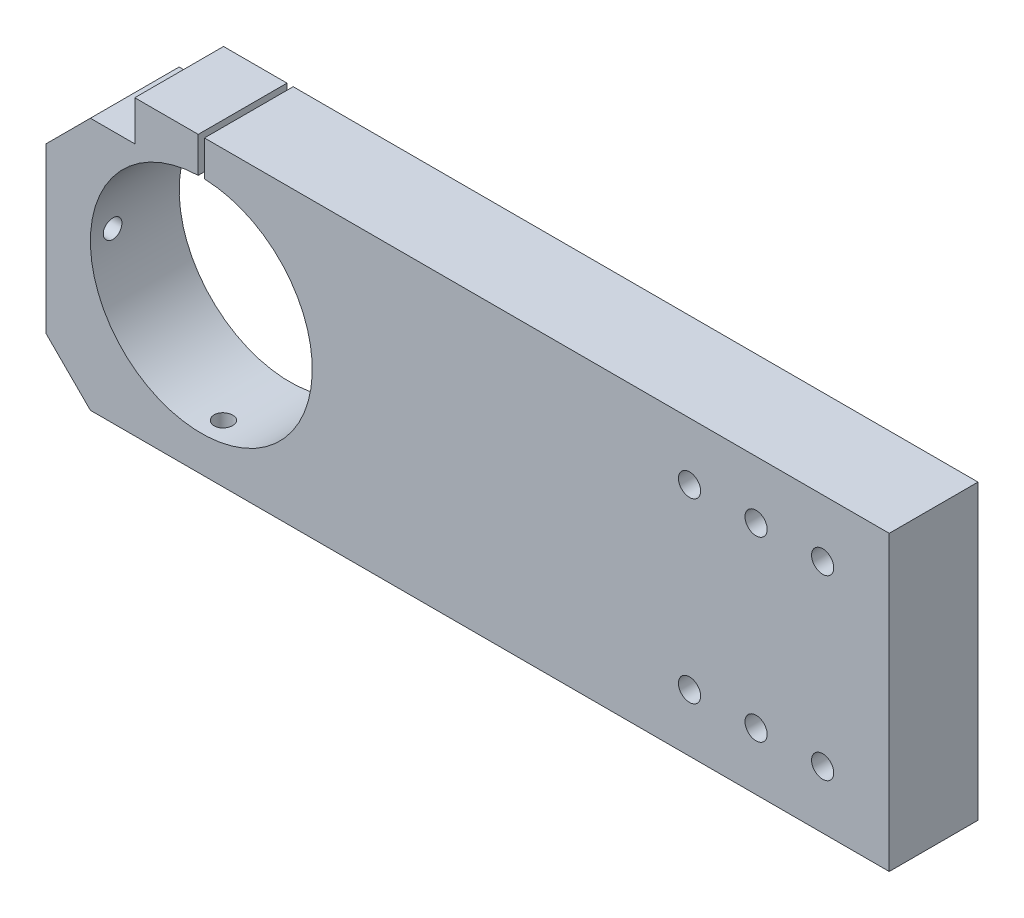
ISO-10303-21;
HEADER;
FILE_DESCRIPTION(('STEP AP214'),'2;1');
FILE_NAME('part.step','',(''),(''),'','','');
FILE_SCHEMA(('AUTOMOTIVE_DESIGN { 1 0 10303 214 1 1 1 1 }'));
ENDSEC;
DATA;
#1=APPLICATION_CONTEXT('core data for automotive mechanical design processes');
#2=APPLICATION_PROTOCOL_DEFINITION('international standard','automotive_design',2000,#1);
#3=PRODUCT_CONTEXT('',#1,'mechanical');
#4=PRODUCT('Part','Part','',(#3));
#5=PRODUCT_RELATED_PRODUCT_CATEGORY('part','',(#4));
#6=PRODUCT_DEFINITION_FORMATION('','',#4);
#7=PRODUCT_DEFINITION_CONTEXT('part definition',#1,'design');
#8=PRODUCT_DEFINITION('design','',#6,#7);
#9=PRODUCT_DEFINITION_SHAPE('','',#8);
#10=(LENGTH_UNIT() NAMED_UNIT(*) SI_UNIT(.MILLI.,.METRE.));
#11=(NAMED_UNIT(*) PLANE_ANGLE_UNIT() SI_UNIT($,.RADIAN.));
#12=(NAMED_UNIT(*) SI_UNIT($,.STERADIAN.) SOLID_ANGLE_UNIT());
#13=UNCERTAINTY_MEASURE_WITH_UNIT(LENGTH_MEASURE(1.E-05),#10,'distance_accuracy_value','');
#14=(GEOMETRIC_REPRESENTATION_CONTEXT(3) GLOBAL_UNCERTAINTY_ASSIGNED_CONTEXT((#13)) GLOBAL_UNIT_ASSIGNED_CONTEXT((#10,
#11,#12)) REPRESENTATION_CONTEXT('',''));
#15=CARTESIAN_POINT('',(0.,0.,0.));
#16=DIRECTION('',(0.,0.,1.));
#17=DIRECTION('',(1.,0.,0.));
#18=AXIS2_PLACEMENT_3D('',#15,#16,#17);
#19=CARTESIAN_POINT('',(0.,66.,20.));
#20=DIRECTION('',(0.,-1.,0.));
#21=DIRECTION('',(0.,0.,-1.));
#22=AXIS2_PLACEMENT_3D('',#19,#20,#21);
#23=PLANE('',#22);
#24=DIRECTION('',(-1.,0.,0.));
#25=VECTOR('',#24,1.);
#26=CARTESIAN_POINT('',(0.,66.,20.));
#27=LINE('',#26,#25);
#28=CARTESIAN_POINT('',(34.3,66.,20.));
#29=VERTEX_POINT('',#28);
#30=CARTESIAN_POINT('',(20.,66.,20.));
#31=VERTEX_POINT('',#30);
#32=EDGE_CURVE('E225',#29,#31,#27,.T.);
#33=ORIENTED_EDGE('',*,*,#32,.F.);
#34=DIRECTION('',(0.,0.,-1.));
#35=VECTOR('',#34,1.);
#36=CARTESIAN_POINT('',(34.3,66.,20.));
#37=LINE('',#36,#35);
#38=CARTESIAN_POINT('',(34.3,66.,0.));
#39=VERTEX_POINT('',#38);
#40=EDGE_CURVE('E187',#29,#39,#37,.T.);
#41=ORIENTED_EDGE('',*,*,#40,.T.);
#42=DIRECTION('',(-1.,0.,0.));
#43=VECTOR('',#42,1.);
#44=CARTESIAN_POINT('',(0.,66.,0.));
#45=LINE('',#44,#43);
#46=CARTESIAN_POINT('',(20.,66.,0.));
#47=VERTEX_POINT('',#46);
#48=EDGE_CURVE('E235',#39,#47,#45,.T.);
#49=ORIENTED_EDGE('',*,*,#48,.T.);
#50=DIRECTION('',(0.,0.,-1.));
#51=VECTOR('',#50,1.);
#52=CARTESIAN_POINT('',(20.,66.,20.));
#53=LINE('',#52,#51);
#54=EDGE_CURVE('E202',#31,#47,#53,.T.);
#55=ORIENTED_EDGE('',*,*,#54,.F.);
#56=EDGE_LOOP('',(#33,#41,#49,#55));
#57=FACE_BOUND('',#56,.T.);
#58=ADVANCED_FACE('F49',(#57),#23,.F.);
#59=CARTESIAN_POINT('',(0.,0.,20.));
#60=DIRECTION('',(1.,0.,0.));
#61=DIRECTION('',(0.,0.,-1.));
#62=AXIS2_PLACEMENT_3D('',#59,#60,#61);
#63=PLANE('',#62);
#64=CARTESIAN_POINT('',(0.,33.,15.));
#65=DIRECTION('',(-1.,0.,0.));
#66=DIRECTION('',(0.,0.,1.));
#67=AXIS2_PLACEMENT_3D('',#64,#65,#66);
#68=CIRCLE('',#67,2.09999999999999);
#69=CARTESIAN_POINT('',(0.,33.,17.1));
#70=VERTEX_POINT('',#69);
#71=EDGE_CURVE('E266',#70,#70,#68,.T.);
#72=ORIENTED_EDGE('',*,*,#71,.F.);
#73=EDGE_LOOP('',(#72));
#74=FACE_BOUND('',#73,.T.);
#75=DIRECTION('',(0.,-1.,0.));
#76=VECTOR('',#75,1.);
#77=CARTESIAN_POINT('',(0.,0.,0.));
#78=LINE('',#77,#76);
#79=CARTESIAN_POINT('',(0.,47.,0.));
#80=VERTEX_POINT('',#79);
#81=CARTESIAN_POINT('',(0.,10.,0.));
#82=VERTEX_POINT('',#81);
#83=EDGE_CURVE('E215',#80,#82,#78,.T.);
#84=ORIENTED_EDGE('',*,*,#83,.T.);
#85=DIRECTION('',(0.,0.,1.));
#86=VECTOR('',#85,1.);
#87=CARTESIAN_POINT('',(0.,10.,20.));
#88=LINE('',#87,#86);
#89=CARTESIAN_POINT('',(0.,10.,20.));
#90=VERTEX_POINT('',#89);
#91=EDGE_CURVE('E64',#82,#90,#88,.T.);
#92=ORIENTED_EDGE('',*,*,#91,.T.);
#93=DIRECTION('',(0.,-1.,0.));
#94=VECTOR('',#93,1.);
#95=CARTESIAN_POINT('',(0.,0.,20.));
#96=LINE('',#95,#94);
#97=CARTESIAN_POINT('',(0.,47.,20.));
#98=VERTEX_POINT('',#97);
#99=EDGE_CURVE('E218',#98,#90,#96,.T.);
#100=ORIENTED_EDGE('',*,*,#99,.F.);
#101=DIRECTION('',(0.,0.,-1.));
#102=VECTOR('',#101,1.);
#103=CARTESIAN_POINT('',(0.,47.,20.));
#104=LINE('',#103,#102);
#105=EDGE_CURVE('E249',#98,#80,#104,.T.);
#106=ORIENTED_EDGE('',*,*,#105,.T.);
#107=EDGE_LOOP('',(#84,#92,#100,#106));
#108=FACE_BOUND('',#107,.T.);
#109=ADVANCED_FACE('F355',(#74,#108),#63,.F.);
#110=CARTESIAN_POINT('',(0.,0.,20.));
#111=DIRECTION('',(0.,1.,0.));
#112=DIRECTION('',(0.,0.,1.));
#113=AXIS2_PLACEMENT_3D('',#110,#111,#112);
#114=PLANE('',#113);
#115=CARTESIAN_POINT('',(35.,0.,15.));
#116=DIRECTION('',(0.,-1.,0.));
#117=DIRECTION('',(0.,0.,-1.));
#118=AXIS2_PLACEMENT_3D('',#115,#116,#117);
#119=CIRCLE('',#118,2.09999999999999);
#120=CARTESIAN_POINT('',(35.,0.,12.9));
#121=VERTEX_POINT('',#120);
#122=EDGE_CURVE('E267',#121,#121,#119,.T.);
#123=ORIENTED_EDGE('',*,*,#122,.F.);
#124=EDGE_LOOP('',(#123));
#125=FACE_BOUND('',#124,.T.);
#126=DIRECTION('',(1.,0.,0.));
#127=VECTOR('',#126,1.);
#128=CARTESIAN_POINT('',(0.,0.,20.));
#129=LINE('',#128,#127);
#130=CARTESIAN_POINT('',(10.,0.,20.));
#131=VERTEX_POINT('',#130);
#132=CARTESIAN_POINT('',(190.,0.,20.));
#133=VERTEX_POINT('',#132);
#134=EDGE_CURVE('E220',#131,#133,#129,.T.);
#135=ORIENTED_EDGE('',*,*,#134,.F.);
#136=DIRECTION('',(0.,0.,-1.));
#137=VECTOR('',#136,1.);
#138=CARTESIAN_POINT('',(10.,0.,20.));
#139=LINE('',#138,#137);
#140=CARTESIAN_POINT('',(10.,0.,0.));
#141=VERTEX_POINT('',#140);
#142=EDGE_CURVE('E258',#131,#141,#139,.T.);
#143=ORIENTED_EDGE('',*,*,#142,.T.);
#144=DIRECTION('',(1.,0.,0.));
#145=VECTOR('',#144,1.);
#146=CARTESIAN_POINT('',(0.,0.,0.));
#147=LINE('',#146,#145);
#148=CARTESIAN_POINT('',(190.,0.,0.));
#149=VERTEX_POINT('',#148);
#150=EDGE_CURVE('E231',#141,#149,#147,.T.);
#151=ORIENTED_EDGE('',*,*,#150,.T.);
#152=DIRECTION('',(0.,0.,-1.));
#153=VECTOR('',#152,1.);
#154=CARTESIAN_POINT('',(190.,0.,20.));
#155=LINE('',#154,#153);
#156=EDGE_CURVE('E240',#133,#149,#155,.T.);
#157=ORIENTED_EDGE('',*,*,#156,.F.);
#158=EDGE_LOOP('',(#135,#143,#151,#157));
#159=FACE_BOUND('',#158,.T.);
#160=ADVANCED_FACE('F362',(#125,#159),#114,.F.);
#161=CARTESIAN_POINT('',(190.,0.,20.));
#162=DIRECTION('',(-1.,0.,0.));
#163=DIRECTION('',(0.,0.,1.));
#164=AXIS2_PLACEMENT_3D('',#161,#162,#163);
#165=PLANE('',#164);
#166=DIRECTION('',(0.,1.,0.));
#167=VECTOR('',#166,1.);
#168=CARTESIAN_POINT('',(190.,0.,0.));
#169=LINE('',#168,#167);
#170=CARTESIAN_POINT('',(190.,66.,0.));
#171=VERTEX_POINT('',#170);
#172=EDGE_CURVE('E233',#149,#171,#169,.T.);
#173=ORIENTED_EDGE('',*,*,#172,.T.);
#174=DIRECTION('',(0.,0.,-1.));
#175=VECTOR('',#174,1.);
#176=CARTESIAN_POINT('',(190.,66.,20.));
#177=LINE('',#176,#175);
#178=CARTESIAN_POINT('',(190.,66.,20.));
#179=VERTEX_POINT('',#178);
#180=EDGE_CURVE('E229',#179,#171,#177,.T.);
#181=ORIENTED_EDGE('',*,*,#180,.F.);
#182=DIRECTION('',(0.,1.,0.));
#183=VECTOR('',#182,1.);
#184=CARTESIAN_POINT('',(190.,0.,20.));
#185=LINE('',#184,#183);
#186=EDGE_CURVE('E223',#133,#179,#185,.T.);
#187=ORIENTED_EDGE('',*,*,#186,.F.);
#188=ORIENTED_EDGE('',*,*,#156,.T.);
#189=EDGE_LOOP('',(#173,#181,#187,#188));
#190=FACE_BOUND('',#189,.T.);
#191=ADVANCED_FACE('F368',(#190),#165,.F.);
#192=CARTESIAN_POINT('',(35.7,66.,0.));
#193=VERTEX_POINT('',#192);
#194=EDGE_CURVE('E221',#171,#193,#45,.T.);
#195=ORIENTED_EDGE('',*,*,#194,.T.);
#196=DIRECTION('',(0.,0.,-1.));
#197=VECTOR('',#196,1.);
#198=CARTESIAN_POINT('',(35.7,66.,20.));
#199=LINE('',#198,#197);
#200=CARTESIAN_POINT('',(35.7,66.,20.));
#201=VERTEX_POINT('',#200);
#202=EDGE_CURVE('E190',#201,#193,#199,.T.);
#203=ORIENTED_EDGE('',*,*,#202,.F.);
#204=EDGE_CURVE('E226',#179,#201,#27,.T.);
#205=ORIENTED_EDGE('',*,*,#204,.F.);
#206=ORIENTED_EDGE('',*,*,#180,.T.);
#207=EDGE_LOOP('',(#195,#203,#205,#206));
#208=FACE_BOUND('',#207,.T.);
#209=ADVANCED_FACE('F358',(#208),#23,.F.);
#210=CARTESIAN_POINT('',(0.,66.,20.));
#211=DIRECTION('',(0.,0.,-1.));
#212=DIRECTION('',(-1.,0.,0.));
#213=AXIS2_PLACEMENT_3D('',#210,#211,#212);
#214=PLANE('',#213);
#215=CARTESIAN_POINT('',(160.,13.,20.));
#216=DIRECTION('',(0.,0.,-1.));
#217=DIRECTION('',(-1.,0.,0.));
#218=AXIS2_PLACEMENT_3D('',#215,#216,#217);
#219=CIRCLE('',#218,2.5);
#220=CARTESIAN_POINT('',(157.5,13.,20.));
#221=VERTEX_POINT('',#220);
#222=EDGE_CURVE('E318',#221,#221,#219,.T.);
#223=ORIENTED_EDGE('',*,*,#222,.T.);
#224=EDGE_LOOP('',(#223));
#225=FACE_BOUND('',#224,.T.);
#226=CARTESIAN_POINT('',(160.,53.,20.));
#227=DIRECTION('',(0.,0.,-1.));
#228=DIRECTION('',(-1.,0.,0.));
#229=AXIS2_PLACEMENT_3D('',#226,#227,#228);
#230=CIRCLE('',#229,2.5);
#231=CARTESIAN_POINT('',(157.5,53.,20.));
#232=VERTEX_POINT('',#231);
#233=EDGE_CURVE('E312',#232,#232,#230,.T.);
#234=ORIENTED_EDGE('',*,*,#233,.T.);
#235=EDGE_LOOP('',(#234));
#236=FACE_BOUND('',#235,.T.);
#237=CARTESIAN_POINT('',(175.,53.,20.));
#238=DIRECTION('',(0.,0.,-1.));
#239=DIRECTION('',(-1.,0.,0.));
#240=AXIS2_PLACEMENT_3D('',#237,#238,#239);
#241=CIRCLE('',#240,2.5);
#242=CARTESIAN_POINT('',(172.5,53.,20.));
#243=VERTEX_POINT('',#242);
#244=EDGE_CURVE('E303',#243,#243,#241,.T.);
#245=ORIENTED_EDGE('',*,*,#244,.T.);
#246=EDGE_LOOP('',(#245));
#247=FACE_BOUND('',#246,.T.);
#248=CARTESIAN_POINT('',(175.,13.,20.));
#249=DIRECTION('',(0.,0.,-1.));
#250=DIRECTION('',(-1.,0.,0.));
#251=AXIS2_PLACEMENT_3D('',#248,#249,#250);
#252=CIRCLE('',#251,2.5);
#253=CARTESIAN_POINT('',(172.5,13.,20.));
#254=VERTEX_POINT('',#253);
#255=EDGE_CURVE('E297',#254,#254,#252,.T.);
#256=ORIENTED_EDGE('',*,*,#255,.T.);
#257=EDGE_LOOP('',(#256));
#258=FACE_BOUND('',#257,.T.);
#259=ORIENTED_EDGE('',*,*,#99,.T.);
#260=DIRECTION('',(-0.707106781186547,0.707106781186549,0.));
#261=VECTOR('',#260,1.);
#262=CARTESIAN_POINT('',(10.,0.,20.));
#263=LINE('',#262,#261);
#264=EDGE_CURVE('E396',#90,#131,#263,.F.);
#265=ORIENTED_EDGE('',*,*,#264,.T.);
#266=ORIENTED_EDGE('',*,*,#134,.T.);
#267=ORIENTED_EDGE('',*,*,#186,.T.);
#268=ORIENTED_EDGE('',*,*,#204,.T.);
#269=DIRECTION('',(0.,-1.,0.));
#270=VECTOR('',#269,1.);
#271=CARTESIAN_POINT('',(35.7,66.,20.));
#272=LINE('',#271,#270);
#273=CARTESIAN_POINT('',(35.7,57.9901980784467,20.));
#274=VERTEX_POINT('',#273);
#275=EDGE_CURVE('E183',#201,#274,#272,.T.);
#276=ORIENTED_EDGE('',*,*,#275,.T.);
#277=CARTESIAN_POINT('',(35.,33.,20.));
#278=DIRECTION('',(0.,0.,-1.));
#279=DIRECTION('',(-1.,0.,0.));
#280=AXIS2_PLACEMENT_3D('',#277,#278,#279);
#281=CIRCLE('',#280,25.);
#282=CARTESIAN_POINT('',(34.3,57.9901980784467,20.));
#283=VERTEX_POINT('',#282);
#284=EDGE_CURVE('E212',#274,#283,#281,.T.);
#285=ORIENTED_EDGE('',*,*,#284,.T.);
#286=DIRECTION('',(0.,1.,0.));
#287=VECTOR('',#286,1.);
#288=CARTESIAN_POINT('',(34.3,66.,20.));
#289=LINE('',#288,#287);
#290=EDGE_CURVE('E180',#283,#29,#289,.T.);
#291=ORIENTED_EDGE('',*,*,#290,.T.);
#292=ORIENTED_EDGE('',*,*,#32,.T.);
#293=DIRECTION('',(0.,-1.,0.));
#294=VECTOR('',#293,1.);
#295=CARTESIAN_POINT('',(20.,66.,20.));
#296=LINE('',#295,#294);
#297=CARTESIAN_POINT('',(20.,57.,20.));
#298=VERTEX_POINT('',#297);
#299=EDGE_CURVE('E195',#31,#298,#296,.T.);
#300=ORIENTED_EDGE('',*,*,#299,.T.);
#301=DIRECTION('',(-1.,0.,0.));
#302=VECTOR('',#301,1.);
#303=CARTESIAN_POINT('',(0.,57.,20.));
#304=LINE('',#303,#302);
#305=CARTESIAN_POINT('',(10.,57.,20.));
#306=VERTEX_POINT('',#305);
#307=EDGE_CURVE('E198',#298,#306,#304,.T.);
#308=ORIENTED_EDGE('',*,*,#307,.T.);
#309=DIRECTION('',(0.707106781186549,0.707106781186547,0.));
#310=VECTOR('',#309,1.);
#311=CARTESIAN_POINT('',(0.,47.,20.));
#312=LINE('',#311,#310);
#313=EDGE_CURVE('E256',#306,#98,#312,.F.);
#314=ORIENTED_EDGE('',*,*,#313,.T.);
#315=EDGE_LOOP('',(#259,#265,#266,#267,#268,#276,#285,#291,#292,#300,#308,#314));
#316=FACE_BOUND('',#315,.T.);
#317=CARTESIAN_POINT('',(145.,53.,20.));
#318=DIRECTION('',(0.,0.,-1.));
#319=DIRECTION('',(-1.,0.,0.));
#320=AXIS2_PLACEMENT_3D('',#317,#318,#319);
#321=CIRCLE('',#320,2.5);
#322=CARTESIAN_POINT('',(142.5,53.,20.));
#323=VERTEX_POINT('',#322);
#324=EDGE_CURVE('E400',#323,#323,#321,.T.);
#325=ORIENTED_EDGE('',*,*,#324,.T.);
#326=EDGE_LOOP('',(#325));
#327=FACE_BOUND('',#326,.T.);
#328=CARTESIAN_POINT('',(145.,13.,20.));
#329=DIRECTION('',(0.,0.,-1.));
#330=DIRECTION('',(-1.,0.,0.));
#331=AXIS2_PLACEMENT_3D('',#328,#329,#330);
#332=CIRCLE('',#331,2.5);
#333=CARTESIAN_POINT('',(142.5,13.,20.));
#334=VERTEX_POINT('',#333);
#335=EDGE_CURVE('E57',#334,#334,#332,.T.);
#336=ORIENTED_EDGE('',*,*,#335,.T.);
#337=EDGE_LOOP('',(#336));
#338=FACE_BOUND('',#337,.T.);
#339=ADVANCED_FACE('F322',(#225,#236,#247,#258,#316,#327,#338),#214,.F.);
#340=CARTESIAN_POINT('',(0.,66.,0.));
#341=DIRECTION('',(0.,0.,-1.));
#342=DIRECTION('',(-1.,0.,0.));
#343=AXIS2_PLACEMENT_3D('',#340,#341,#342);
#344=PLANE('',#343);
#345=CARTESIAN_POINT('',(160.,13.,0.));
#346=DIRECTION('',(0.,0.,-1.));
#347=DIRECTION('',(-1.,0.,0.));
#348=AXIS2_PLACEMENT_3D('',#345,#346,#347);
#349=CIRCLE('',#348,2.5);
#350=CARTESIAN_POINT('',(157.5,13.,0.));
#351=VERTEX_POINT('',#350);
#352=EDGE_CURVE('E315',#351,#351,#349,.T.);
#353=ORIENTED_EDGE('',*,*,#352,.F.);
#354=EDGE_LOOP('',(#353));
#355=FACE_BOUND('',#354,.T.);
#356=CARTESIAN_POINT('',(160.,53.,0.));
#357=DIRECTION('',(0.,0.,-1.));
#358=DIRECTION('',(-1.,0.,0.));
#359=AXIS2_PLACEMENT_3D('',#356,#357,#358);
#360=CIRCLE('',#359,2.5);
#361=CARTESIAN_POINT('',(157.5,53.,0.));
#362=VERTEX_POINT('',#361);
#363=EDGE_CURVE('E309',#362,#362,#360,.T.);
#364=ORIENTED_EDGE('',*,*,#363,.F.);
#365=EDGE_LOOP('',(#364));
#366=FACE_BOUND('',#365,.T.);
#367=CARTESIAN_POINT('',(175.,53.,0.));
#368=DIRECTION('',(0.,0.,-1.));
#369=DIRECTION('',(-1.,0.,0.));
#370=AXIS2_PLACEMENT_3D('',#367,#368,#369);
#371=CIRCLE('',#370,2.5);
#372=CARTESIAN_POINT('',(172.5,53.,0.));
#373=VERTEX_POINT('',#372);
#374=EDGE_CURVE('E306',#373,#373,#371,.T.);
#375=ORIENTED_EDGE('',*,*,#374,.F.);
#376=EDGE_LOOP('',(#375));
#377=FACE_BOUND('',#376,.T.);
#378=CARTESIAN_POINT('',(175.,13.,0.));
#379=DIRECTION('',(0.,0.,-1.));
#380=DIRECTION('',(-1.,0.,0.));
#381=AXIS2_PLACEMENT_3D('',#378,#379,#380);
#382=CIRCLE('',#381,2.5);
#383=CARTESIAN_POINT('',(172.5,13.,0.));
#384=VERTEX_POINT('',#383);
#385=EDGE_CURVE('E300',#384,#384,#382,.T.);
#386=ORIENTED_EDGE('',*,*,#385,.F.);
#387=EDGE_LOOP('',(#386));
#388=FACE_BOUND('',#387,.T.);
#389=ORIENTED_EDGE('',*,*,#150,.F.);
#390=DIRECTION('',(0.707106781186547,-0.707106781186549,0.));
#391=VECTOR('',#390,1.);
#392=CARTESIAN_POINT('',(-28.,38.0000000000001,0.));
#393=LINE('',#392,#391);
#394=EDGE_CURVE('E72',#141,#82,#393,.F.);
#395=ORIENTED_EDGE('',*,*,#394,.T.);
#396=ORIENTED_EDGE('',*,*,#83,.F.);
#397=DIRECTION('',(-0.707106781186549,-0.707106781186547,0.));
#398=VECTOR('',#397,1.);
#399=CARTESIAN_POINT('',(9.50000000000001,56.5,0.));
#400=LINE('',#399,#398);
#401=CARTESIAN_POINT('',(10.,57.,0.));
#402=VERTEX_POINT('',#401);
#403=EDGE_CURVE('E252',#80,#402,#400,.F.);
#404=ORIENTED_EDGE('',*,*,#403,.T.);
#405=DIRECTION('',(-1.,0.,0.));
#406=VECTOR('',#405,1.);
#407=CARTESIAN_POINT('',(0.,57.,0.));
#408=LINE('',#407,#406);
#409=CARTESIAN_POINT('',(20.,57.,0.));
#410=VERTEX_POINT('',#409);
#411=EDGE_CURVE('E199',#410,#402,#408,.T.);
#412=ORIENTED_EDGE('',*,*,#411,.F.);
#413=DIRECTION('',(0.,-1.,0.));
#414=VECTOR('',#413,1.);
#415=CARTESIAN_POINT('',(20.,66.,0.));
#416=LINE('',#415,#414);
#417=EDGE_CURVE('E192',#47,#410,#416,.T.);
#418=ORIENTED_EDGE('',*,*,#417,.F.);
#419=ORIENTED_EDGE('',*,*,#48,.F.);
#420=DIRECTION('',(0.,1.,0.));
#421=VECTOR('',#420,1.);
#422=CARTESIAN_POINT('',(34.3,66.,0.));
#423=LINE('',#422,#421);
#424=CARTESIAN_POINT('',(34.3,57.9901980784467,0.));
#425=VERTEX_POINT('',#424);
#426=EDGE_CURVE('E179',#425,#39,#423,.T.);
#427=ORIENTED_EDGE('',*,*,#426,.F.);
#428=CARTESIAN_POINT('',(35.,33.,0.));
#429=DIRECTION('',(0.,0.,-1.));
#430=DIRECTION('',(-1.,0.,0.));
#431=AXIS2_PLACEMENT_3D('',#428,#429,#430);
#432=CIRCLE('',#431,25.);
#433=CARTESIAN_POINT('',(35.7,57.9901980784467,0.));
#434=VERTEX_POINT('',#433);
#435=EDGE_CURVE('E209',#434,#425,#432,.T.);
#436=ORIENTED_EDGE('',*,*,#435,.F.);
#437=DIRECTION('',(0.,-1.,0.));
#438=VECTOR('',#437,1.);
#439=CARTESIAN_POINT('',(35.7,66.,0.));
#440=LINE('',#439,#438);
#441=EDGE_CURVE('E184',#193,#434,#440,.T.);
#442=ORIENTED_EDGE('',*,*,#441,.F.);
#443=ORIENTED_EDGE('',*,*,#194,.F.);
#444=ORIENTED_EDGE('',*,*,#172,.F.);
#445=EDGE_LOOP('',(#389,#395,#396,#404,#412,#418,#419,#427,#436,#442,#443,#444));
#446=FACE_BOUND('',#445,.T.);
#447=CARTESIAN_POINT('',(145.,53.,0.));
#448=DIRECTION('',(0.,0.,-1.));
#449=DIRECTION('',(-1.,0.,0.));
#450=AXIS2_PLACEMENT_3D('',#447,#448,#449);
#451=CIRCLE('',#450,2.5);
#452=CARTESIAN_POINT('',(142.5,53.,0.));
#453=VERTEX_POINT('',#452);
#454=EDGE_CURVE('E346',#453,#453,#451,.T.);
#455=ORIENTED_EDGE('',*,*,#454,.F.);
#456=EDGE_LOOP('',(#455));
#457=FACE_BOUND('',#456,.T.);
#458=CARTESIAN_POINT('',(145.,13.,0.));
#459=DIRECTION('',(0.,0.,-1.));
#460=DIRECTION('',(-1.,0.,0.));
#461=AXIS2_PLACEMENT_3D('',#458,#459,#460);
#462=CIRCLE('',#461,2.5);
#463=CARTESIAN_POINT('',(142.5,13.,0.));
#464=VERTEX_POINT('',#463);
#465=EDGE_CURVE('E13',#464,#464,#462,.T.);
#466=ORIENTED_EDGE('',*,*,#465,.F.);
#467=EDGE_LOOP('',(#466));
#468=FACE_BOUND('',#467,.T.);
#469=ADVANCED_FACE('F332',(#355,#366,#377,#388,#446,#457,#468),#344,.T.);
#470=CARTESIAN_POINT('',(35.,33.,20.));
#471=DIRECTION('',(0.,0.,-1.));
#472=DIRECTION('',(-1.,0.,0.));
#473=AXIS2_PLACEMENT_3D('',#470,#471,#472);
#474=CYLINDRICAL_SURFACE('',#473,25.);
#475=CARTESIAN_POINT('',(35.,7.99999999999999,12.9));
#476=CARTESIAN_POINT('',(35.1177352783013,8.00000115488606,12.9000051408791));
#477=CARTESIAN_POINT('',(35.2355506214571,8.00084056094198,12.9099344453353));
#478=CARTESIAN_POINT('',(35.4679213554313,8.00410841132111,12.9493980688019));
#479=CARTESIAN_POINT('',(35.5824729034685,8.00653865405473,12.9789545765367));
#480=CARTESIAN_POINT('',(35.8049169840241,8.01271355940635,13.0568116625786));
#481=CARTESIAN_POINT('',(35.9128132534793,8.01645747634984,13.1051016089535));
#482=CARTESIAN_POINT('',(36.1189430333512,8.02483991454837,13.2190357180899));
#483=CARTESIAN_POINT('',(36.2171785992232,8.02947824487943,13.2846761782686));
#484=CARTESIAN_POINT('',(36.4014783013193,8.03914248165488,13.4316313716932));
#485=CARTESIAN_POINT('',(36.487513997325,8.04416925284801,13.5129817187292));
#486=CARTESIAN_POINT('',(36.6447276901954,8.05403657071035,13.6889721753222));
#487=CARTESIAN_POINT('',(36.7159050331262,8.05887710917558,13.7836128694969));
#488=CARTESIAN_POINT('',(36.8414779874834,8.06783318482658,13.983669935315));
#489=CARTESIAN_POINT('',(36.8958485756664,8.07194763708617,14.0891020664206));
#490=CARTESIAN_POINT('',(36.9861047941802,8.078975761126,14.3076393660494));
#491=CARTESIAN_POINT('',(37.0219907557417,8.08188945442275,14.4207443970391));
#492=CARTESIAN_POINT('',(37.0741764924337,8.08617887677492,14.651131713523));
#493=CARTESIAN_POINT('',(37.0905226330064,8.08755824603781,14.7684034277508));
#494=CARTESIAN_POINT('',(37.1033079599496,8.08863434241399,15.0040334873598));
#495=CARTESIAN_POINT('',(37.0997475253731,8.08833110156684,15.1223918120075));
#496=CARTESIAN_POINT('',(37.0728590862967,8.08607954829749,15.35651752407));
#497=CARTESIAN_POINT('',(37.0495814807632,8.08413543015907,15.4722907455866));
#498=CARTESIAN_POINT('',(36.9839977695796,8.07882775532496,15.6982810938201));
#499=CARTESIAN_POINT('',(36.9416914754658,8.07546418457077,15.8084981654959));
#500=CARTESIAN_POINT('',(36.8391949080723,8.06769177044973,16.0204081135657));
#501=CARTESIAN_POINT('',(36.7789820322351,8.06328160745305,16.122090007194));
#502=CARTESIAN_POINT('',(36.6423978168818,8.05391414158301,16.3139231142982));
#503=CARTESIAN_POINT('',(36.5660261447876,8.04895682744925,16.404074090385));
#504=CARTESIAN_POINT('',(36.3990096176639,8.03903496920524,16.5705793446656));
#505=CARTESIAN_POINT('',(36.3083211936169,8.03407045041746,16.6468899284008));
#506=CARTESIAN_POINT('',(36.1153974495413,8.02470821945034,16.7832103527582));
#507=CARTESIAN_POINT('',(36.0131621216337,8.02031050765777,16.8432201822577));
#508=CARTESIAN_POINT('',(35.8000181872971,8.01257653627317,16.9452329542325));
#509=CARTESIAN_POINT('',(35.6891086453093,8.00924039137384,16.9872339511868));
#510=CARTESIAN_POINT('',(35.4617776797128,8.00400675680558,17.0520061588965));
#511=CARTESIAN_POINT('',(35.3453563723892,8.00210923679941,17.0747777751557));
#512=CARTESIAN_POINT('',(35.1106853747472,7.99997054575322,17.1003900122088));
#513=CARTESIAN_POINT('',(34.992442314973,7.99972435932172,17.1032909842246));
#514=CARTESIAN_POINT('',(34.7571515337775,8.00090267701532,17.0892376989712));
#515=CARTESIAN_POINT('',(34.6401038010353,8.00232716530257,17.0722836299261));
#516=CARTESIAN_POINT('',(34.4106983899788,8.00668341136638,17.0190515490914));
#517=CARTESIAN_POINT('',(34.2983341731986,8.00961298617196,16.9828015213358));
#518=CARTESIAN_POINT('',(34.0812828403295,8.01665032163601,16.8920351174363));
#519=CARTESIAN_POINT('',(33.9765958475365,8.02075810121119,16.8375184480091));
#520=CARTESIAN_POINT('',(33.7775960617659,8.02970390146248,16.7116146994927));
#521=CARTESIAN_POINT('',(33.6833086353112,8.03454364226497,16.6401876509329));
#522=CARTESIAN_POINT('',(33.5080405421837,8.04440387918544,16.482548418167));
#523=CARTESIAN_POINT('',(33.4270601104714,8.04942437849316,16.3963359729511));
#524=CARTESIAN_POINT('',(33.2804976385377,8.05909514497734,16.2113112635592));
#525=CARTESIAN_POINT('',(33.2149549894621,8.06374444546135,16.1124677391878));
#526=CARTESIAN_POINT('',(33.101398716546,8.07213268050712,15.9051422282657));
#527=CARTESIAN_POINT('',(33.0533849152823,8.07587162428319,15.7966603392862));
#528=CARTESIAN_POINT('',(32.9763163299322,8.08201036521238,15.5732768202399));
#529=CARTESIAN_POINT('',(32.9472374570474,8.08441186328315,15.4583835495978));
#530=CARTESIAN_POINT('',(32.9087857522753,8.08760948633615,15.2253242522826));
#531=CARTESIAN_POINT('',(32.8994125351914,8.0884056426988,15.1071582896283));
#532=CARTESIAN_POINT('',(32.9006426961369,8.08830197367111,14.8712993802416));
#533=CARTESIAN_POINT('',(32.9111841822916,8.08740740280066,14.7536061034461));
#534=CARTESIAN_POINT('',(32.9518154338912,8.08403424112624,14.5216678625957));
#535=CARTESIAN_POINT('',(32.9819052289033,8.08155564792642,14.4074229037566));
#536=CARTESIAN_POINT('',(33.0607632303909,8.0752951028711,14.1856204242271));
#537=CARTESIAN_POINT('',(33.1095302953292,8.07151323067221,14.0780624952986));
#538=CARTESIAN_POINT('',(33.2243516001317,8.06307212083486,13.8726503009238));
#539=CARTESIAN_POINT('',(33.2904055750837,8.05841289664163,13.7747958868083));
#540=CARTESIAN_POINT('',(33.4381582270317,8.04872483669745,13.5912516975067));
#541=CARTESIAN_POINT('',(33.5199027415577,8.04369494529817,13.5055988772096));
#542=CARTESIAN_POINT('',(33.6966325555482,8.03384193197634,13.3491945719311));
#543=CARTESIAN_POINT('',(33.7916210528491,8.02901886036049,13.2784466962254));
#544=CARTESIAN_POINT('',(33.9923283144631,8.020114084077,13.1537641194458));
#545=CARTESIAN_POINT('',(34.0980669661894,8.01603379390454,13.099861359914));
#546=CARTESIAN_POINT('',(34.3170563528454,8.00909085834524,13.0106443337383));
#547=CARTESIAN_POINT('',(34.4302982893934,8.00622681500228,12.9753087148391));
#548=CARTESIAN_POINT('',(34.6201727322574,8.00277374277055,12.9332213799956));
#549=CARTESIAN_POINT('',(34.6955843910162,8.00173832868148,12.9207799380569));
#550=CARTESIAN_POINT('',(34.8473194759794,8.00035108372071,12.9041675921898));
#551=CARTESIAN_POINT('',(34.9236428997166,7.99999925099976,12.8999966658879));
#552=CARTESIAN_POINT('',(35.,7.99999999999999,12.9));
#553=B_SPLINE_CURVE_WITH_KNOTS('',3,(#475,#476,#477,#478,#479,#480,#481,#482,#483,#484,#485,
#486,#487,#488,#489,#490,#491,#492,#493,#494,#495,#496,#497,#498,#499,#500,#501,#502,#503,#504,
#505,#506,#507,#508,#509,#510,#511,#512,#513,#514,#515,#516,#517,#518,#519,#520,#521,#522,#523,
#524,#525,#526,#527,#528,#529,#530,#531,#532,#533,#534,#535,#536,#537,#538,#539,#540,#541,#542,
#543,#544,#545,#546,#547,#548,#549,#550,#551,#552),.UNSPECIFIED.,.T.,.F.,(4,2,2,2,2,2,2,2,2,2,2,
2,2,2,2,2,2,2,2,2,2,2,2,2,2,2,2,2,2,2,2,2,2,2,2,2,2,2,4),(0.,0.352927046496939,
0.706253760891373,1.05938024173724,1.4124314264912,1.76629256661712,2.12016927731718,
2.47457035810149,2.8289650880625,3.1825172056825,3.53606259113143,3.88870699850852,
4.24135489861776,4.59444983114923,4.94755203174141,5.30175028419993,5.65594877834427,
6.01018552744687,6.36441480631846,6.7175677392908,7.07071732443182,7.42335614292492,
7.77600062354197,8.12948708788754,8.48297979304837,8.83736493102254,9.19174648188694,
9.54567630719704,9.89959921399324,10.2524239912755,10.6052493022132,10.95805305224,
11.3108513960647,11.664696519822,12.0186272299693,12.3732250440697,12.7274141724007,
12.9563052845041,13.185195777404),.UNSPECIFIED.);
#554=CARTESIAN_POINT('',(35.,7.99999999999999,12.9));
#555=VERTEX_POINT('',#554);
#556=EDGE_CURVE('E259',#555,#555,#553,.T.);
#557=ORIENTED_EDGE('',*,*,#556,.T.);
#558=EDGE_LOOP('',(#557));
#559=FACE_BOUND('',#558,.T.);
#560=CARTESIAN_POINT('',(10.,33.,17.1));
#561=CARTESIAN_POINT('',(10.0000011548861,33.1177352783013,17.0999948591209));
#562=CARTESIAN_POINT('',(10.000840560942,33.2355506214571,17.0900655546647));
#563=CARTESIAN_POINT('',(10.0041084113211,33.4679213554313,17.0506019311981));
#564=CARTESIAN_POINT('',(10.0065386540547,33.5824729034685,17.0210454234633));
#565=CARTESIAN_POINT('',(10.0127135594064,33.8049169840241,16.9431883374214));
#566=CARTESIAN_POINT('',(10.0164574763498,33.9128132534793,16.8948983910465));
#567=CARTESIAN_POINT('',(10.0248399145484,34.1189430333512,16.7809642819101));
#568=CARTESIAN_POINT('',(10.0294782448794,34.2171785992232,16.7153238217314));
#569=CARTESIAN_POINT('',(10.0391424816549,34.4014783013193,16.5683686283068));
#570=CARTESIAN_POINT('',(10.044169252848,34.487513997325,16.4870182812708));
#571=CARTESIAN_POINT('',(10.0540365707104,34.6447276901954,16.3110278246778));
#572=CARTESIAN_POINT('',(10.0588771091756,34.7159050331262,16.2163871305031));
#573=CARTESIAN_POINT('',(10.0678331848266,34.8414779874834,16.016330064685));
#574=CARTESIAN_POINT('',(10.0719476370862,34.8958485756664,15.9108979335794));
#575=CARTESIAN_POINT('',(10.078975761126,34.9861047941802,15.6923606339506));
#576=CARTESIAN_POINT('',(10.0818894544228,35.0219907557417,15.5792556029609));
#577=CARTESIAN_POINT('',(10.0861788767749,35.0741764924337,15.348868286477));
#578=CARTESIAN_POINT('',(10.0875582460378,35.0905226330064,15.2315965722492));
#579=CARTESIAN_POINT('',(10.088634342414,35.1033079599496,14.9959665126402));
#580=CARTESIAN_POINT('',(10.0883311015668,35.0997475253731,14.8776081879925));
#581=CARTESIAN_POINT('',(10.0860795482975,35.0728590862967,14.64348247593));
#582=CARTESIAN_POINT('',(10.0841354301591,35.0495814807632,14.5277092544134));
#583=CARTESIAN_POINT('',(10.078827755325,34.9839977695796,14.3017189061799));
#584=CARTESIAN_POINT('',(10.0754641845708,34.9416914754658,14.1915018345041));
#585=CARTESIAN_POINT('',(10.0676917704497,34.8391949080723,13.9795918864343));
#586=CARTESIAN_POINT('',(10.0632816074531,34.7789820322351,13.877909992806));
#587=CARTESIAN_POINT('',(10.053914141583,34.6423978168818,13.6860768857018));
#588=CARTESIAN_POINT('',(10.0489568274493,34.5660261447876,13.595925909615));
#589=CARTESIAN_POINT('',(10.0390349692053,34.3990096176638,13.4294206553344));
#590=CARTESIAN_POINT('',(10.0340704504175,34.3083211936169,13.3531100715992));
#591=CARTESIAN_POINT('',(10.0247082194504,34.1153974495413,13.2167896472418));
#592=CARTESIAN_POINT('',(10.0203105076578,34.0131621216337,13.1567798177423));
#593=CARTESIAN_POINT('',(10.0125765362732,33.8000181872971,13.0547670457675));
#594=CARTESIAN_POINT('',(10.0092403913739,33.6891086453093,13.0127660488132));
#595=CARTESIAN_POINT('',(10.0040067568056,33.4617776797128,12.9479938411035));
#596=CARTESIAN_POINT('',(10.0021092367994,33.3453563723892,12.9252222248443));
#597=CARTESIAN_POINT('',(9.99997054575323,33.1106853747472,12.8996099877912));
#598=CARTESIAN_POINT('',(9.99972435932173,32.992442314973,12.8967090157754));
#599=CARTESIAN_POINT('',(10.0009026770153,32.7571515337775,12.9107623010288));
#600=CARTESIAN_POINT('',(10.0023271653026,32.6401038010353,12.9277163700739));
#601=CARTESIAN_POINT('',(10.0066834113664,32.4106983899788,12.9809484509086));
#602=CARTESIAN_POINT('',(10.009612986172,32.2983341731986,13.0171984786642));
#603=CARTESIAN_POINT('',(10.016650321636,32.0812828403295,13.1079648825637));
#604=CARTESIAN_POINT('',(10.0207581012112,31.9765958475365,13.1624815519909));
#605=CARTESIAN_POINT('',(10.0297039014625,31.7775960617659,13.2883853005073));
#606=CARTESIAN_POINT('',(10.034543642265,31.6833086353112,13.3598123490671));
#607=CARTESIAN_POINT('',(10.0444038791854,31.5080405421836,13.517451581833));
#608=CARTESIAN_POINT('',(10.0494243784932,31.4270601104714,13.6036640270489));
#609=CARTESIAN_POINT('',(10.0590951449774,31.2804976385377,13.7886887364408));
#610=CARTESIAN_POINT('',(10.0637444454614,31.2149549894621,13.8875322608122));
#611=CARTESIAN_POINT('',(10.0721326805071,31.101398716546,14.0948577717343));
#612=CARTESIAN_POINT('',(10.0758716242832,31.0533849152822,14.2033396607138));
#613=CARTESIAN_POINT('',(10.0820103652124,30.9763163299322,14.4267231797601));
#614=CARTESIAN_POINT('',(10.0844118632832,30.9472374570474,14.5416164504022));
#615=CARTESIAN_POINT('',(10.0876094863362,30.9087857522753,14.7746757477174));
#616=CARTESIAN_POINT('',(10.0884056426988,30.8994125351914,14.8928417103717));
#617=CARTESIAN_POINT('',(10.0883019736711,30.9006426961369,15.1287006197584));
#618=CARTESIAN_POINT('',(10.0874074028007,30.9111841822916,15.2463938965539));
#619=CARTESIAN_POINT('',(10.0840342411262,30.9518154338912,15.4783321374043));
#620=CARTESIAN_POINT('',(10.0815556479264,30.9819052289033,15.5925770962434));
#621=CARTESIAN_POINT('',(10.0752951028711,31.0607632303909,15.8143795757729));
#622=CARTESIAN_POINT('',(10.0715132306722,31.1095302953292,15.9219375047014));
#623=CARTESIAN_POINT('',(10.0630721208349,31.2243516001317,16.1273496990762));
#624=CARTESIAN_POINT('',(10.0584128966416,31.2904055750837,16.2252041131917));
#625=CARTESIAN_POINT('',(10.0487248366975,31.4381582270317,16.4087483024933));
#626=CARTESIAN_POINT('',(10.0436949452982,31.5199027415577,16.4944011227904));
#627=CARTESIAN_POINT('',(10.0338419319764,31.6966325555482,16.6508054280689));
#628=CARTESIAN_POINT('',(10.0290188603605,31.7916210528491,16.7215533037746));
#629=CARTESIAN_POINT('',(10.020114084077,31.9923283144631,16.8462358805542));
#630=CARTESIAN_POINT('',(10.0160337939046,32.0980669661894,16.9001386400859));
#631=CARTESIAN_POINT('',(10.0090908583452,32.3170563528454,16.9893556662617));
#632=CARTESIAN_POINT('',(10.0062268150023,32.4302982893934,17.0246912851609));
#633=CARTESIAN_POINT('',(10.0027737427706,32.6201727322573,17.0667786200043));
#634=CARTESIAN_POINT('',(10.0017383286815,32.6955843910162,17.0792200619431));
#635=CARTESIAN_POINT('',(10.0003510837207,32.8473194759794,17.0958324078102));
#636=CARTESIAN_POINT('',(9.99999925099976,32.9236428997166,17.1000033341121));
#637=CARTESIAN_POINT('',(10.,33.,17.1));
#638=B_SPLINE_CURVE_WITH_KNOTS('',3,(#560,#561,#562,#563,#564,#565,#566,#567,#568,#569,#570,
#571,#572,#573,#574,#575,#576,#577,#578,#579,#580,#581,#582,#583,#584,#585,#586,#587,#588,#589,
#590,#591,#592,#593,#594,#595,#596,#597,#598,#599,#600,#601,#602,#603,#604,#605,#606,#607,#608,
#609,#610,#611,#612,#613,#614,#615,#616,#617,#618,#619,#620,#621,#622,#623,#624,#625,#626,#627,
#628,#629,#630,#631,#632,#633,#634,#635,#636,#637),.UNSPECIFIED.,.T.,.F.,(4,2,2,2,2,2,2,2,2,2,2,
2,2,2,2,2,2,2,2,2,2,2,2,2,2,2,2,2,2,2,2,2,2,2,2,2,2,2,4),(0.,0.352927046496939,
0.706253760891373,1.05938024173724,1.4124314264912,1.76629256661712,2.12016927731719,
2.47457035810149,2.8289650880625,3.1825172056825,3.53606259113143,3.88870699850852,
4.24135489861775,4.59444983114922,4.94755203174141,5.30175028419993,5.65594877834427,
6.01018552744687,6.36441480631846,6.7175677392908,7.07071732443182,7.42335614292492,
7.77600062354197,8.12948708788754,8.48297979304837,8.83736493102254,9.19174648188694,
9.54567630719705,9.89959921399324,10.2524239912755,10.6052493022132,10.95805305224,
11.3108513960647,11.664696519822,12.0186272299693,12.3732250440697,12.7274141724007,
12.9563052845041,13.185195777404),.UNSPECIFIED.);
#639=CARTESIAN_POINT('',(10.,33.,17.1));
#640=VERTEX_POINT('',#639);
#641=EDGE_CURVE('E161',#640,#640,#638,.T.);
#642=ORIENTED_EDGE('',*,*,#641,.T.);
#643=EDGE_LOOP('',(#642));
#644=FACE_BOUND('',#643,.T.);
#645=ORIENTED_EDGE('',*,*,#435,.T.);
#646=DIRECTION('',(0.,0.,-1.));
#647=VECTOR('',#646,1.);
#648=CARTESIAN_POINT('',(34.3,57.9901980784467,20.));
#649=LINE('',#648,#647);
#650=EDGE_CURVE('E246',#425,#283,#649,.F.);
#651=ORIENTED_EDGE('',*,*,#650,.T.);
#652=ORIENTED_EDGE('',*,*,#284,.F.);
#653=DIRECTION('',(0.,0.,-1.));
#654=VECTOR('',#653,1.);
#655=CARTESIAN_POINT('',(35.7,57.9901980784467,20.));
#656=LINE('',#655,#654);
#657=EDGE_CURVE('E243',#274,#434,#656,.T.);
#658=ORIENTED_EDGE('',*,*,#657,.T.);
#659=EDGE_LOOP('',(#645,#651,#652,#658));
#660=FACE_BOUND('',#659,.T.);
#661=ADVANCED_FACE('F269',(#559,#644,#660),#474,.F.);
#662=CARTESIAN_POINT('',(0.,57.,20.));
#663=DIRECTION('',(0.,-1.,0.));
#664=DIRECTION('',(0.,0.,-1.));
#665=AXIS2_PLACEMENT_3D('',#662,#663,#664);
#666=PLANE('',#665);
#667=ORIENTED_EDGE('',*,*,#411,.T.);
#668=DIRECTION('',(0.,0.,1.));
#669=VECTOR('',#668,1.);
#670=CARTESIAN_POINT('',(10.,57.,20.));
#671=LINE('',#670,#669);
#672=EDGE_CURVE('E254',#402,#306,#671,.T.);
#673=ORIENTED_EDGE('',*,*,#672,.T.);
#674=ORIENTED_EDGE('',*,*,#307,.F.);
#675=DIRECTION('',(0.,0.,-1.));
#676=VECTOR('',#675,1.);
#677=CARTESIAN_POINT('',(20.,57.,20.));
#678=LINE('',#677,#676);
#679=EDGE_CURVE('E207',#298,#410,#678,.T.);
#680=ORIENTED_EDGE('',*,*,#679,.T.);
#681=EDGE_LOOP('',(#667,#673,#674,#680));
#682=FACE_BOUND('',#681,.T.);
#683=ADVANCED_FACE('F435',(#682),#666,.F.);
#684=CARTESIAN_POINT('',(20.,66.,20.));
#685=DIRECTION('',(1.,0.,0.));
#686=DIRECTION('',(0.,1.,0.));
#687=AXIS2_PLACEMENT_3D('',#684,#685,#686);
#688=PLANE('',#687);
#689=CARTESIAN_POINT('',(20.,61.5,5.));
#690=DIRECTION('',(-1.,0.,0.));
#691=DIRECTION('',(0.,1.,0.));
#692=AXIS2_PLACEMENT_3D('',#689,#690,#691);
#693=CIRCLE('',#692,2.25);
#694=CARTESIAN_POINT('',(20.,63.75,5.));
#695=VERTEX_POINT('',#694);
#696=EDGE_CURVE('E167',#695,#695,#693,.T.);
#697=ORIENTED_EDGE('',*,*,#696,.F.);
#698=EDGE_LOOP('',(#697));
#699=FACE_BOUND('',#698,.T.);
#700=CARTESIAN_POINT('',(20.,61.5,15.));
#701=DIRECTION('',(-1.,0.,0.));
#702=DIRECTION('',(0.,-1.,0.));
#703=AXIS2_PLACEMENT_3D('',#700,#701,#702);
#704=CIRCLE('',#703,2.25);
#705=CARTESIAN_POINT('',(20.,59.25,15.));
#706=VERTEX_POINT('',#705);
#707=EDGE_CURVE('E173',#706,#706,#704,.T.);
#708=ORIENTED_EDGE('',*,*,#707,.F.);
#709=EDGE_LOOP('',(#708));
#710=FACE_BOUND('',#709,.T.);
#711=ORIENTED_EDGE('',*,*,#417,.T.);
#712=ORIENTED_EDGE('',*,*,#679,.F.);
#713=ORIENTED_EDGE('',*,*,#299,.F.);
#714=ORIENTED_EDGE('',*,*,#54,.T.);
#715=EDGE_LOOP('',(#711,#712,#713,#714));
#716=FACE_BOUND('',#715,.T.);
#717=ADVANCED_FACE('F448',(#699,#710,#716),#688,.F.);
#718=CARTESIAN_POINT('',(35.7,66.,20.));
#719=DIRECTION('',(1.,0.,0.));
#720=DIRECTION('',(0.,0.,-1.));
#721=AXIS2_PLACEMENT_3D('',#718,#719,#720);
#722=PLANE('',#721);
#723=CARTESIAN_POINT('',(35.7,61.5,15.));
#724=DIRECTION('',(-1.,0.,0.));
#725=DIRECTION('',(0.,0.,1.));
#726=AXIS2_PLACEMENT_3D('',#723,#724,#725);
#727=CIRCLE('',#726,1.64999999999999);
#728=CARTESIAN_POINT('',(35.7,61.5,16.65));
#729=VERTEX_POINT('',#728);
#730=EDGE_CURVE('E155',#729,#729,#727,.T.);
#731=ORIENTED_EDGE('',*,*,#730,.F.);
#732=EDGE_LOOP('',(#731));
#733=FACE_BOUND('',#732,.T.);
#734=CARTESIAN_POINT('',(35.7,61.5,5.));
#735=DIRECTION('',(-1.,0.,0.));
#736=DIRECTION('',(0.,0.,1.));
#737=AXIS2_PLACEMENT_3D('',#734,#735,#736);
#738=CIRCLE('',#737,1.64999999999999);
#739=CARTESIAN_POINT('',(35.7,61.5,6.64999999999999));
#740=VERTEX_POINT('',#739);
#741=EDGE_CURVE('E154',#740,#740,#738,.T.);
#742=ORIENTED_EDGE('',*,*,#741,.F.);
#743=EDGE_LOOP('',(#742));
#744=FACE_BOUND('',#743,.T.);
#745=ORIENTED_EDGE('',*,*,#275,.F.);
#746=ORIENTED_EDGE('',*,*,#202,.T.);
#747=ORIENTED_EDGE('',*,*,#441,.T.);
#748=ORIENTED_EDGE('',*,*,#657,.F.);
#749=EDGE_LOOP('',(#745,#746,#747,#748));
#750=FACE_BOUND('',#749,.T.);
#751=ADVANCED_FACE('F383',(#733,#744,#750),#722,.F.);
#752=CARTESIAN_POINT('',(34.3,66.,20.));
#753=DIRECTION('',(-1.,0.,0.));
#754=DIRECTION('',(0.,0.,1.));
#755=AXIS2_PLACEMENT_3D('',#752,#753,#754);
#756=PLANE('',#755);
#757=CARTESIAN_POINT('',(34.3,61.5,5.));
#758=DIRECTION('',(-1.,0.,0.));
#759=DIRECTION('',(0.,0.,1.));
#760=AXIS2_PLACEMENT_3D('',#757,#758,#759);
#761=CIRCLE('',#760,2.25);
#762=CARTESIAN_POINT('',(34.3,61.5,7.25));
#763=VERTEX_POINT('',#762);
#764=EDGE_CURVE('E170',#763,#763,#761,.F.);
#765=ORIENTED_EDGE('',*,*,#764,.F.);
#766=EDGE_LOOP('',(#765));
#767=FACE_BOUND('',#766,.T.);
#768=CARTESIAN_POINT('',(34.3,61.5,15.));
#769=DIRECTION('',(-1.,0.,0.));
#770=DIRECTION('',(0.,0.,1.));
#771=AXIS2_PLACEMENT_3D('',#768,#769,#770);
#772=CIRCLE('',#771,2.25);
#773=CARTESIAN_POINT('',(34.3,61.5,17.25));
#774=VERTEX_POINT('',#773);
#775=EDGE_CURVE('E176',#774,#774,#772,.F.);
#776=ORIENTED_EDGE('',*,*,#775,.F.);
#777=EDGE_LOOP('',(#776));
#778=FACE_BOUND('',#777,.T.);
#779=ORIENTED_EDGE('',*,*,#426,.T.);
#780=ORIENTED_EDGE('',*,*,#40,.F.);
#781=ORIENTED_EDGE('',*,*,#290,.F.);
#782=ORIENTED_EDGE('',*,*,#650,.F.);
#783=EDGE_LOOP('',(#779,#780,#781,#782));
#784=FACE_BOUND('',#783,.T.);
#785=ADVANCED_FACE('F422',(#767,#778,#784),#756,.F.);
#786=CARTESIAN_POINT('',(0.,47.,20.));
#787=DIRECTION('',(0.707106781186547,-0.707106781186549,0.));
#788=DIRECTION('',(0.707106781186549,0.707106781186547,0.));
#789=AXIS2_PLACEMENT_3D('',#786,#787,#788);
#790=PLANE('',#789);
#791=ORIENTED_EDGE('',*,*,#313,.F.);
#792=ORIENTED_EDGE('',*,*,#672,.F.);
#793=ORIENTED_EDGE('',*,*,#403,.F.);
#794=ORIENTED_EDGE('',*,*,#105,.F.);
#795=EDGE_LOOP('',(#791,#792,#793,#794));
#796=FACE_BOUND('',#795,.T.);
#797=ADVANCED_FACE('F419',(#796),#790,.F.);
#798=CARTESIAN_POINT('',(40.6639610306789,61.5,15.));
#799=DIRECTION('',(-1.,0.,0.));
#800=DIRECTION('',(0.,-1.,0.));
#801=AXIS2_PLACEMENT_3D('',#798,#799,#800);
#802=CYLINDRICAL_SURFACE('',#801,2.25);
#803=ORIENTED_EDGE('',*,*,#775,.T.);
#804=EDGE_LOOP('',(#803));
#805=FACE_BOUND('',#804,.T.);
#806=ORIENTED_EDGE('',*,*,#707,.T.);
#807=EDGE_LOOP('',(#806));
#808=FACE_BOUND('',#807,.T.);
#809=ADVANCED_FACE('F421',(#805,#808),#802,.F.);
#810=CARTESIAN_POINT('',(40.6639610306789,61.5,5.));
#811=DIRECTION('',(-1.,0.,0.));
#812=DIRECTION('',(0.,-1.,0.));
#813=AXIS2_PLACEMENT_3D('',#810,#811,#812);
#814=CYLINDRICAL_SURFACE('',#813,2.25);
#815=ORIENTED_EDGE('',*,*,#764,.T.);
#816=EDGE_LOOP('',(#815));
#817=FACE_BOUND('',#816,.T.);
#818=ORIENTED_EDGE('',*,*,#696,.T.);
#819=EDGE_LOOP('',(#818));
#820=FACE_BOUND('',#819,.T.);
#821=ADVANCED_FACE('F474',(#817,#820),#814,.F.);
#822=CARTESIAN_POINT('',(45.8,61.5,5.));
#823=DIRECTION('',(-1.,0.,0.));
#824=DIRECTION('',(0.,0.,1.));
#825=AXIS2_PLACEMENT_3D('',#822,#823,#824);
#826=CONICAL_SURFACE('',#825,1.64999999999999,1.02974425867665);
#827=CARTESIAN_POINT('',(46.7914200213955,61.5,5.));
#828=VERTEX_POINT('',#827);
#829=VERTEX_LOOP('',#828);
#830=FACE_BOUND('',#829,.T.);
#831=CARTESIAN_POINT('',(45.8,61.5,5.));
#832=DIRECTION('',(-1.,0.,0.));
#833=DIRECTION('',(0.,0.,1.));
#834=AXIS2_PLACEMENT_3D('',#831,#832,#833);
#835=CIRCLE('',#834,1.64999999999999);
#836=CARTESIAN_POINT('',(45.8,61.5,6.64999999999999));
#837=VERTEX_POINT('',#836);
#838=EDGE_CURVE('E158',#837,#837,#835,.T.);
#839=ORIENTED_EDGE('',*,*,#838,.T.);
#840=EDGE_LOOP('',(#839));
#841=FACE_BOUND('',#840,.T.);
#842=ADVANCED_FACE('F479',(#830,#841),#826,.F.);
#843=CARTESIAN_POINT('',(35.7,61.5,5.));
#844=DIRECTION('',(-1.,0.,0.));
#845=DIRECTION('',(0.,0.,1.));
#846=AXIS2_PLACEMENT_3D('',#843,#844,#845);
#847=CYLINDRICAL_SURFACE('',#846,1.64999999999999);
#848=ORIENTED_EDGE('',*,*,#838,.F.);
#849=EDGE_LOOP('',(#848));
#850=FACE_BOUND('',#849,.T.);
#851=ORIENTED_EDGE('',*,*,#741,.T.);
#852=EDGE_LOOP('',(#851));
#853=FACE_BOUND('',#852,.T.);
#854=ADVANCED_FACE('F148',(#850,#853),#847,.F.);
#855=CARTESIAN_POINT('',(45.8,61.5,15.));
#856=DIRECTION('',(-1.,0.,0.));
#857=DIRECTION('',(0.,0.,1.));
#858=AXIS2_PLACEMENT_3D('',#855,#856,#857);
#859=CONICAL_SURFACE('',#858,1.64999999999999,1.02974425867665);
#860=CARTESIAN_POINT('',(46.7914200213955,61.5,15.));
#861=VERTEX_POINT('',#860);
#862=VERTEX_LOOP('',#861);
#863=FACE_BOUND('',#862,.T.);
#864=CARTESIAN_POINT('',(45.8,61.5,15.));
#865=DIRECTION('',(-1.,0.,0.));
#866=DIRECTION('',(0.,0.,1.));
#867=AXIS2_PLACEMENT_3D('',#864,#865,#866);
#868=CIRCLE('',#867,1.64999999999999);
#869=CARTESIAN_POINT('',(45.8,61.5,16.65));
#870=VERTEX_POINT('',#869);
#871=EDGE_CURVE('E152',#870,#870,#868,.T.);
#872=ORIENTED_EDGE('',*,*,#871,.T.);
#873=EDGE_LOOP('',(#872));
#874=FACE_BOUND('',#873,.T.);
#875=ADVANCED_FACE('F144',(#863,#874),#859,.F.);
#876=CARTESIAN_POINT('',(35.7,61.5,15.));
#877=DIRECTION('',(-1.,0.,0.));
#878=DIRECTION('',(0.,0.,1.));
#879=AXIS2_PLACEMENT_3D('',#876,#877,#878);
#880=CYLINDRICAL_SURFACE('',#879,1.64999999999999);
#881=ORIENTED_EDGE('',*,*,#871,.F.);
#882=EDGE_LOOP('',(#881));
#883=FACE_BOUND('',#882,.T.);
#884=ORIENTED_EDGE('',*,*,#730,.T.);
#885=EDGE_LOOP('',(#884));
#886=FACE_BOUND('',#885,.T.);
#887=ADVANCED_FACE('F147',(#883,#886),#880,.F.);
#888=CARTESIAN_POINT('',(0.,33.,15.));
#889=DIRECTION('',(-1.,0.,0.));
#890=DIRECTION('',(0.,0.,1.));
#891=AXIS2_PLACEMENT_3D('',#888,#889,#890);
#892=CYLINDRICAL_SURFACE('',#891,2.09999999999999);
#893=ORIENTED_EDGE('',*,*,#641,.F.);
#894=EDGE_LOOP('',(#893));
#895=FACE_BOUND('',#894,.T.);
#896=ORIENTED_EDGE('',*,*,#71,.T.);
#897=EDGE_LOOP('',(#896));
#898=FACE_BOUND('',#897,.T.);
#899=ADVANCED_FACE('F279',(#895,#898),#892,.F.);
#900=CARTESIAN_POINT('',(35.,0.,15.));
#901=DIRECTION('',(0.,-1.,0.));
#902=DIRECTION('',(0.,0.,-1.));
#903=AXIS2_PLACEMENT_3D('',#900,#901,#902);
#904=CYLINDRICAL_SURFACE('',#903,2.09999999999999);
#905=ORIENTED_EDGE('',*,*,#122,.T.);
#906=EDGE_LOOP('',(#905));
#907=FACE_BOUND('',#906,.T.);
#908=ORIENTED_EDGE('',*,*,#556,.F.);
#909=EDGE_LOOP('',(#908));
#910=FACE_BOUND('',#909,.T.);
#911=ADVANCED_FACE('F273',(#907,#910),#904,.F.);
#912=CARTESIAN_POINT('',(10.,0.,20.));
#913=DIRECTION('',(0.707106781186549,0.707106781186547,0.));
#914=DIRECTION('',(-0.707106781186547,0.707106781186549,0.));
#915=AXIS2_PLACEMENT_3D('',#912,#913,#914);
#916=PLANE('',#915);
#917=ORIENTED_EDGE('',*,*,#264,.F.);
#918=ORIENTED_EDGE('',*,*,#91,.F.);
#919=ORIENTED_EDGE('',*,*,#394,.F.);
#920=ORIENTED_EDGE('',*,*,#142,.F.);
#921=EDGE_LOOP('',(#917,#918,#919,#920));
#922=FACE_BOUND('',#921,.T.);
#923=ADVANCED_FACE('F278',(#922),#916,.F.);
#924=CARTESIAN_POINT('',(175.,13.,0.));
#925=DIRECTION('',(0.,0.,-1.));
#926=DIRECTION('',(-1.,0.,0.));
#927=AXIS2_PLACEMENT_3D('',#924,#925,#926);
#928=CYLINDRICAL_SURFACE('',#927,2.5);
#929=ORIENTED_EDGE('',*,*,#255,.F.);
#930=EDGE_LOOP('',(#929));
#931=FACE_BOUND('',#930,.T.);
#932=ORIENTED_EDGE('',*,*,#385,.T.);
#933=EDGE_LOOP('',(#932));
#934=FACE_BOUND('',#933,.T.);
#935=ADVANCED_FACE('F281',(#931,#934),#928,.F.);
#936=CARTESIAN_POINT('',(175.,53.,0.));
#937=DIRECTION('',(0.,0.,-1.));
#938=DIRECTION('',(-1.,0.,0.));
#939=AXIS2_PLACEMENT_3D('',#936,#937,#938);
#940=CYLINDRICAL_SURFACE('',#939,2.5);
#941=ORIENTED_EDGE('',*,*,#244,.F.);
#942=EDGE_LOOP('',(#941));
#943=FACE_BOUND('',#942,.T.);
#944=ORIENTED_EDGE('',*,*,#374,.T.);
#945=EDGE_LOOP('',(#944));
#946=FACE_BOUND('',#945,.T.);
#947=ADVANCED_FACE('F412',(#943,#946),#940,.F.);
#948=CARTESIAN_POINT('',(160.,53.,0.));
#949=DIRECTION('',(0.,0.,-1.));
#950=DIRECTION('',(-1.,0.,0.));
#951=AXIS2_PLACEMENT_3D('',#948,#949,#950);
#952=CYLINDRICAL_SURFACE('',#951,2.5);
#953=ORIENTED_EDGE('',*,*,#233,.F.);
#954=EDGE_LOOP('',(#953));
#955=FACE_BOUND('',#954,.T.);
#956=ORIENTED_EDGE('',*,*,#363,.T.);
#957=EDGE_LOOP('',(#956));
#958=FACE_BOUND('',#957,.T.);
#959=ADVANCED_FACE('F407',(#955,#958),#952,.F.);
#960=CARTESIAN_POINT('',(145.,53.,0.));
#961=DIRECTION('',(0.,0.,-1.));
#962=DIRECTION('',(-1.,0.,0.));
#963=AXIS2_PLACEMENT_3D('',#960,#961,#962);
#964=CYLINDRICAL_SURFACE('',#963,2.5);
#965=ORIENTED_EDGE('',*,*,#324,.F.);
#966=EDGE_LOOP('',(#965));
#967=FACE_BOUND('',#966,.T.);
#968=ORIENTED_EDGE('',*,*,#454,.T.);
#969=EDGE_LOOP('',(#968));
#970=FACE_BOUND('',#969,.T.);
#971=ADVANCED_FACE('F328',(#967,#970),#964,.F.);
#972=CARTESIAN_POINT('',(160.,13.,0.));
#973=DIRECTION('',(0.,0.,-1.));
#974=DIRECTION('',(-1.,0.,0.));
#975=AXIS2_PLACEMENT_3D('',#972,#973,#974);
#976=CYLINDRICAL_SURFACE('',#975,2.5);
#977=ORIENTED_EDGE('',*,*,#222,.F.);
#978=EDGE_LOOP('',(#977));
#979=FACE_BOUND('',#978,.T.);
#980=ORIENTED_EDGE('',*,*,#352,.T.);
#981=EDGE_LOOP('',(#980));
#982=FACE_BOUND('',#981,.T.);
#983=ADVANCED_FACE('F325',(#979,#982),#976,.F.);
#984=CARTESIAN_POINT('',(145.,13.,0.));
#985=DIRECTION('',(0.,0.,-1.));
#986=DIRECTION('',(-1.,0.,0.));
#987=AXIS2_PLACEMENT_3D('',#984,#985,#986);
#988=CYLINDRICAL_SURFACE('',#987,2.5);
#989=ORIENTED_EDGE('',*,*,#335,.F.);
#990=EDGE_LOOP('',(#989));
#991=FACE_BOUND('',#990,.T.);
#992=ORIENTED_EDGE('',*,*,#465,.T.);
#993=EDGE_LOOP('',(#992));
#994=FACE_BOUND('',#993,.T.);
#995=ADVANCED_FACE('F51',(#991,#994),#988,.F.);
#996=CLOSED_SHELL('',(#58,#109,#160,#191,#209,#339,#469,#661,#683,#717,#751,#785,#797,#809,#821,
#842,#854,#875,#887,#899,#911,#923,#935,#947,#959,#971,#983,#995));
#997=MANIFOLD_SOLID_BREP('B2',#996);
#998=ADVANCED_BREP_SHAPE_REPRESENTATION('',(#18,#997),#14);
#999=SHAPE_DEFINITION_REPRESENTATION(#9,#998);
ENDSEC;
END-ISO-10303-21;
